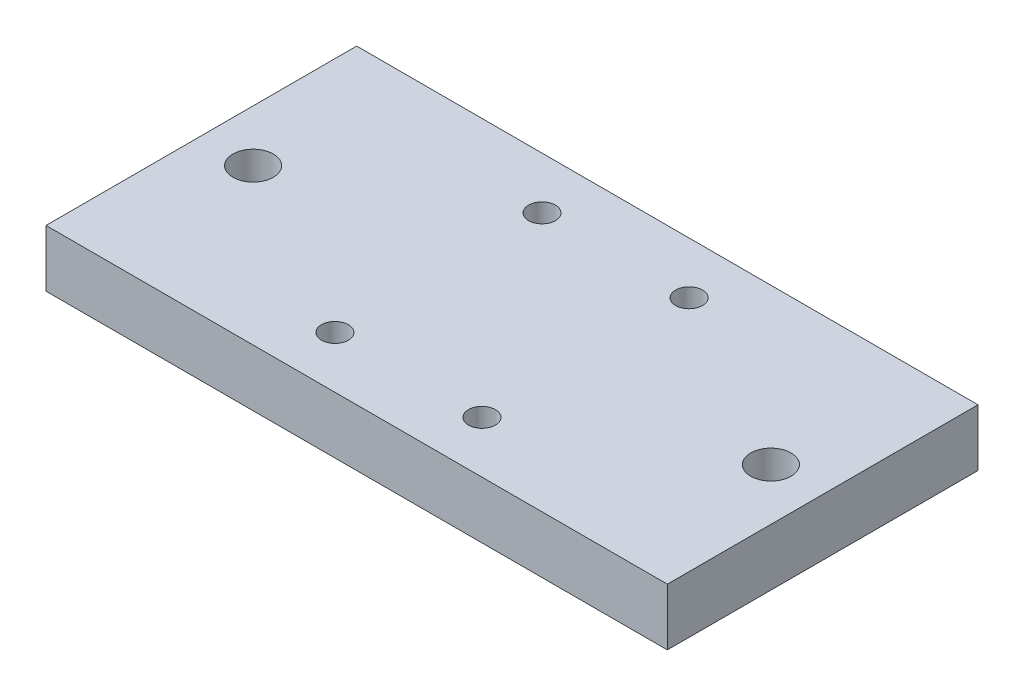
ISO-10303-21;
HEADER;
FILE_DESCRIPTION(('STEP AP214'),'2;1');
FILE_NAME('part.step','',(''),(''),'','','');
FILE_SCHEMA(('AUTOMOTIVE_DESIGN { 1 0 10303 214 1 1 1 1 }'));
ENDSEC;
DATA;
#1=APPLICATION_CONTEXT('core data for automotive mechanical design processes');
#2=APPLICATION_PROTOCOL_DEFINITION('international standard','automotive_design',2000,#1);
#3=PRODUCT_CONTEXT('',#1,'mechanical');
#4=PRODUCT('Part','Part','',(#3));
#5=PRODUCT_RELATED_PRODUCT_CATEGORY('part','',(#4));
#6=PRODUCT_DEFINITION_FORMATION('','',#4);
#7=PRODUCT_DEFINITION_CONTEXT('part definition',#1,'design');
#8=PRODUCT_DEFINITION('design','',#6,#7);
#9=PRODUCT_DEFINITION_SHAPE('','',#8);
#10=(LENGTH_UNIT() NAMED_UNIT(*) SI_UNIT(.MILLI.,.METRE.));
#11=(NAMED_UNIT(*) PLANE_ANGLE_UNIT() SI_UNIT($,.RADIAN.));
#12=(NAMED_UNIT(*) SI_UNIT($,.STERADIAN.) SOLID_ANGLE_UNIT());
#13=UNCERTAINTY_MEASURE_WITH_UNIT(LENGTH_MEASURE(1.E-05),#10,'distance_accuracy_value','');
#14=(GEOMETRIC_REPRESENTATION_CONTEXT(3) GLOBAL_UNCERTAINTY_ASSIGNED_CONTEXT((#13)) GLOBAL_UNIT_ASSIGNED_CONTEXT((#10,
#11,#12)) REPRESENTATION_CONTEXT('',''));
#15=CARTESIAN_POINT('',(0.,0.,0.));
#16=DIRECTION('',(0.,0.,1.));
#17=DIRECTION('',(1.,0.,0.));
#18=AXIS2_PLACEMENT_3D('',#15,#16,#17);
#19=CARTESIAN_POINT('',(0.,55.,-300.));
#20=DIRECTION('',(1.,0.,0.));
#21=DIRECTION('',(0.,0.,-1.));
#22=AXIS2_PLACEMENT_3D('',#19,#20,#21);
#23=PLANE('',#22);
#24=DIRECTION('',(0.,0.,1.));
#25=VECTOR('',#24,1.);
#26=CARTESIAN_POINT('',(0.,0.,-300.));
#27=LINE('',#26,#25);
#28=CARTESIAN_POINT('',(0.,0.,-300.));
#29=VERTEX_POINT('',#28);
#30=CARTESIAN_POINT('',(0.,0.,0.));
#31=VERTEX_POINT('',#30);
#32=EDGE_CURVE('E97',#29,#31,#27,.T.);
#33=ORIENTED_EDGE('',*,*,#32,.T.);
#34=DIRECTION('',(0.,-1.,0.));
#35=VECTOR('',#34,1.);
#36=CARTESIAN_POINT('',(0.,55.,0.));
#37=LINE('',#36,#35);
#38=CARTESIAN_POINT('',(0.,55.,0.));
#39=VERTEX_POINT('',#38);
#40=EDGE_CURVE('E11',#39,#31,#37,.T.);
#41=ORIENTED_EDGE('',*,*,#40,.F.);
#42=DIRECTION('',(0.,0.,1.));
#43=VECTOR('',#42,1.);
#44=CARTESIAN_POINT('',(0.,55.,-300.));
#45=LINE('',#44,#43);
#46=CARTESIAN_POINT('',(0.,55.,-300.));
#47=VERTEX_POINT('',#46);
#48=EDGE_CURVE('E85',#47,#39,#45,.T.);
#49=ORIENTED_EDGE('',*,*,#48,.F.);
#50=DIRECTION('',(0.,-1.,0.));
#51=VECTOR('',#50,1.);
#52=CARTESIAN_POINT('',(0.,55.,-300.));
#53=LINE('',#52,#51);
#54=EDGE_CURVE('E93',#47,#29,#53,.T.);
#55=ORIENTED_EDGE('',*,*,#54,.T.);
#56=EDGE_LOOP('',(#33,#41,#49,#55));
#57=FACE_BOUND('',#56,.T.);
#58=ADVANCED_FACE('F34',(#57),#23,.F.);
#59=CARTESIAN_POINT('',(0.,55.,0.));
#60=DIRECTION('',(0.,0.,-1.));
#61=DIRECTION('',(-1.,0.,0.));
#62=AXIS2_PLACEMENT_3D('',#59,#60,#61);
#63=PLANE('',#62);
#64=DIRECTION('',(1.,0.,0.));
#65=VECTOR('',#64,1.);
#66=CARTESIAN_POINT('',(0.,0.,0.));
#67=LINE('',#66,#65);
#68=CARTESIAN_POINT('',(600.,0.,0.));
#69=VERTEX_POINT('',#68);
#70=EDGE_CURVE('E89',#31,#69,#67,.T.);
#71=ORIENTED_EDGE('',*,*,#70,.T.);
#72=DIRECTION('',(0.,-1.,0.));
#73=VECTOR('',#72,1.);
#74=CARTESIAN_POINT('',(600.,55.,0.));
#75=LINE('',#74,#73);
#76=CARTESIAN_POINT('',(600.,55.,0.));
#77=VERTEX_POINT('',#76);
#78=EDGE_CURVE('E42',#77,#69,#75,.T.);
#79=ORIENTED_EDGE('',*,*,#78,.F.);
#80=DIRECTION('',(1.,0.,0.));
#81=VECTOR('',#80,1.);
#82=CARTESIAN_POINT('',(0.,55.,0.));
#83=LINE('',#82,#81);
#84=EDGE_CURVE('E80',#39,#77,#83,.T.);
#85=ORIENTED_EDGE('',*,*,#84,.F.);
#86=ORIENTED_EDGE('',*,*,#40,.T.);
#87=EDGE_LOOP('',(#71,#79,#85,#86));
#88=FACE_BOUND('',#87,.T.);
#89=ADVANCED_FACE('F88',(#88),#63,.F.);
#90=CARTESIAN_POINT('',(600.,55.,-300.));
#91=DIRECTION('',(-1.,0.,0.));
#92=DIRECTION('',(0.,0.,1.));
#93=AXIS2_PLACEMENT_3D('',#90,#91,#92);
#94=PLANE('',#93);
#95=DIRECTION('',(0.,0.,-1.));
#96=VECTOR('',#95,1.);
#97=CARTESIAN_POINT('',(600.,0.,-300.));
#98=LINE('',#97,#96);
#99=CARTESIAN_POINT('',(600.,0.,-300.));
#100=VERTEX_POINT('',#99);
#101=EDGE_CURVE('E67',#69,#100,#98,.T.);
#102=ORIENTED_EDGE('',*,*,#101,.T.);
#103=DIRECTION('',(0.,-1.,0.));
#104=VECTOR('',#103,1.);
#105=CARTESIAN_POINT('',(600.,55.,-300.));
#106=LINE('',#105,#104);
#107=CARTESIAN_POINT('',(600.,55.,-300.));
#108=VERTEX_POINT('',#107);
#109=EDGE_CURVE('E90',#108,#100,#106,.T.);
#110=ORIENTED_EDGE('',*,*,#109,.F.);
#111=DIRECTION('',(0.,0.,-1.));
#112=VECTOR('',#111,1.);
#113=CARTESIAN_POINT('',(600.,55.,-300.));
#114=LINE('',#113,#112);
#115=EDGE_CURVE('E83',#77,#108,#114,.T.);
#116=ORIENTED_EDGE('',*,*,#115,.F.);
#117=ORIENTED_EDGE('',*,*,#78,.T.);
#118=EDGE_LOOP('',(#102,#110,#116,#117));
#119=FACE_BOUND('',#118,.T.);
#120=ADVANCED_FACE('F91',(#119),#94,.F.);
#121=CARTESIAN_POINT('',(0.,55.,-300.));
#122=DIRECTION('',(0.,0.,1.));
#123=DIRECTION('',(1.,0.,0.));
#124=AXIS2_PLACEMENT_3D('',#121,#122,#123);
#125=PLANE('',#124);
#126=DIRECTION('',(-1.,0.,0.));
#127=VECTOR('',#126,1.);
#128=CARTESIAN_POINT('',(0.,0.,-300.));
#129=LINE('',#128,#127);
#130=EDGE_CURVE('E73',#100,#29,#129,.T.);
#131=ORIENTED_EDGE('',*,*,#130,.T.);
#132=ORIENTED_EDGE('',*,*,#54,.F.);
#133=DIRECTION('',(-1.,0.,0.));
#134=VECTOR('',#133,1.);
#135=CARTESIAN_POINT('',(0.,55.,-300.));
#136=LINE('',#135,#134);
#137=EDGE_CURVE('E50',#108,#47,#136,.T.);
#138=ORIENTED_EDGE('',*,*,#137,.F.);
#139=ORIENTED_EDGE('',*,*,#109,.T.);
#140=EDGE_LOOP('',(#131,#132,#138,#139));
#141=FACE_BOUND('',#140,.T.);
#142=ADVANCED_FACE('F105',(#141),#125,.F.);
#143=CARTESIAN_POINT('',(0.,55.,0.));
#144=DIRECTION('',(0.,1.,0.));
#145=DIRECTION('',(0.,0.,1.));
#146=AXIS2_PLACEMENT_3D('',#143,#144,#145);
#147=PLANE('',#146);
#148=CARTESIAN_POINT('',(229.,55.,-50.));
#149=DIRECTION('',(0.,1.,0.));
#150=DIRECTION('',(0.,0.,1.));
#151=AXIS2_PLACEMENT_3D('',#148,#149,#150);
#152=CIRCLE('',#151,13.);
#153=CARTESIAN_POINT('',(229.,55.,-37.));
#154=VERTEX_POINT('',#153);
#155=EDGE_CURVE('E141',#154,#154,#152,.T.);
#156=ORIENTED_EDGE('',*,*,#155,.F.);
#157=EDGE_LOOP('',(#156));
#158=FACE_BOUND('',#157,.T.);
#159=CARTESIAN_POINT('',(371.,55.,-50.));
#160=DIRECTION('',(0.,1.,0.));
#161=DIRECTION('',(0.,0.,1.));
#162=AXIS2_PLACEMENT_3D('',#159,#160,#161);
#163=CIRCLE('',#162,13.);
#164=CARTESIAN_POINT('',(371.,55.,-37.));
#165=VERTEX_POINT('',#164);
#166=EDGE_CURVE('E135',#165,#165,#163,.T.);
#167=ORIENTED_EDGE('',*,*,#166,.F.);
#168=EDGE_LOOP('',(#167));
#169=FACE_BOUND('',#168,.T.);
#170=CARTESIAN_POINT('',(371.,55.,-250.));
#171=DIRECTION('',(0.,1.,0.));
#172=DIRECTION('',(0.,0.,1.));
#173=AXIS2_PLACEMENT_3D('',#170,#171,#172);
#174=CIRCLE('',#173,13.);
#175=CARTESIAN_POINT('',(371.,55.,-237.));
#176=VERTEX_POINT('',#175);
#177=EDGE_CURVE('E129',#176,#176,#174,.T.);
#178=ORIENTED_EDGE('',*,*,#177,.F.);
#179=EDGE_LOOP('',(#178));
#180=FACE_BOUND('',#179,.T.);
#181=CARTESIAN_POINT('',(229.,55.,-250.));
#182=DIRECTION('',(0.,1.,0.));
#183=DIRECTION('',(0.,0.,1.));
#184=AXIS2_PLACEMENT_3D('',#181,#182,#183);
#185=CIRCLE('',#184,13.);
#186=CARTESIAN_POINT('',(229.,55.,-237.));
#187=VERTEX_POINT('',#186);
#188=EDGE_CURVE('E123',#187,#187,#185,.T.);
#189=ORIENTED_EDGE('',*,*,#188,.F.);
#190=EDGE_LOOP('',(#189));
#191=FACE_BOUND('',#190,.T.);
#192=CARTESIAN_POINT('',(550.,55.,-150.));
#193=DIRECTION('',(0.,1.,0.));
#194=DIRECTION('',(0.,0.,1.));
#195=AXIS2_PLACEMENT_3D('',#192,#193,#194);
#196=CIRCLE('',#195,19.5);
#197=CARTESIAN_POINT('',(550.,55.,-130.5));
#198=VERTEX_POINT('',#197);
#199=EDGE_CURVE('E117',#198,#198,#196,.T.);
#200=ORIENTED_EDGE('',*,*,#199,.F.);
#201=EDGE_LOOP('',(#200));
#202=FACE_BOUND('',#201,.T.);
#203=CARTESIAN_POINT('',(50.,55.,-150.));
#204=DIRECTION('',(0.,1.,0.));
#205=DIRECTION('',(0.,0.,1.));
#206=AXIS2_PLACEMENT_3D('',#203,#204,#205);
#207=CIRCLE('',#206,19.5);
#208=CARTESIAN_POINT('',(50.,55.,-130.5));
#209=VERTEX_POINT('',#208);
#210=EDGE_CURVE('E111',#209,#209,#207,.T.);
#211=ORIENTED_EDGE('',*,*,#210,.F.);
#212=EDGE_LOOP('',(#211));
#213=FACE_BOUND('',#212,.T.);
#214=ORIENTED_EDGE('',*,*,#48,.T.);
#215=ORIENTED_EDGE('',*,*,#84,.T.);
#216=ORIENTED_EDGE('',*,*,#115,.T.);
#217=ORIENTED_EDGE('',*,*,#137,.T.);
#218=EDGE_LOOP('',(#214,#215,#216,#217));
#219=FACE_BOUND('',#218,.T.);
#220=ADVANCED_FACE('F81',(#158,#169,#180,#191,#202,#213,#219),#147,.T.);
#221=CARTESIAN_POINT('',(0.,0.,0.));
#222=DIRECTION('',(0.,1.,0.));
#223=DIRECTION('',(0.,0.,1.));
#224=AXIS2_PLACEMENT_3D('',#221,#222,#223);
#225=PLANE('',#224);
#226=CARTESIAN_POINT('',(229.,0.,-50.));
#227=DIRECTION('',(0.,1.,0.));
#228=DIRECTION('',(0.,0.,1.));
#229=AXIS2_PLACEMENT_3D('',#226,#227,#228);
#230=CIRCLE('',#229,13.);
#231=CARTESIAN_POINT('',(229.,0.,-37.));
#232=VERTEX_POINT('',#231);
#233=EDGE_CURVE('E138',#232,#232,#230,.T.);
#234=ORIENTED_EDGE('',*,*,#233,.T.);
#235=EDGE_LOOP('',(#234));
#236=FACE_BOUND('',#235,.T.);
#237=CARTESIAN_POINT('',(371.,0.,-50.));
#238=DIRECTION('',(0.,1.,0.));
#239=DIRECTION('',(0.,0.,1.));
#240=AXIS2_PLACEMENT_3D('',#237,#238,#239);
#241=CIRCLE('',#240,13.);
#242=CARTESIAN_POINT('',(371.,0.,-37.));
#243=VERTEX_POINT('',#242);
#244=EDGE_CURVE('E132',#243,#243,#241,.T.);
#245=ORIENTED_EDGE('',*,*,#244,.T.);
#246=EDGE_LOOP('',(#245));
#247=FACE_BOUND('',#246,.T.);
#248=CARTESIAN_POINT('',(371.,0.,-250.));
#249=DIRECTION('',(0.,1.,0.));
#250=DIRECTION('',(0.,0.,1.));
#251=AXIS2_PLACEMENT_3D('',#248,#249,#250);
#252=CIRCLE('',#251,13.);
#253=CARTESIAN_POINT('',(371.,0.,-237.));
#254=VERTEX_POINT('',#253);
#255=EDGE_CURVE('E126',#254,#254,#252,.T.);
#256=ORIENTED_EDGE('',*,*,#255,.T.);
#257=EDGE_LOOP('',(#256));
#258=FACE_BOUND('',#257,.T.);
#259=CARTESIAN_POINT('',(229.,0.,-250.));
#260=DIRECTION('',(0.,1.,0.));
#261=DIRECTION('',(0.,0.,1.));
#262=AXIS2_PLACEMENT_3D('',#259,#260,#261);
#263=CIRCLE('',#262,13.);
#264=CARTESIAN_POINT('',(229.,0.,-237.));
#265=VERTEX_POINT('',#264);
#266=EDGE_CURVE('E120',#265,#265,#263,.T.);
#267=ORIENTED_EDGE('',*,*,#266,.T.);
#268=EDGE_LOOP('',(#267));
#269=FACE_BOUND('',#268,.T.);
#270=CARTESIAN_POINT('',(550.,0.,-150.));
#271=DIRECTION('',(0.,1.,0.));
#272=DIRECTION('',(0.,0.,1.));
#273=AXIS2_PLACEMENT_3D('',#270,#271,#272);
#274=CIRCLE('',#273,19.5);
#275=CARTESIAN_POINT('',(550.,0.,-130.5));
#276=VERTEX_POINT('',#275);
#277=EDGE_CURVE('E114',#276,#276,#274,.T.);
#278=ORIENTED_EDGE('',*,*,#277,.T.);
#279=EDGE_LOOP('',(#278));
#280=FACE_BOUND('',#279,.T.);
#281=CARTESIAN_POINT('',(50.,0.,-150.));
#282=DIRECTION('',(0.,1.,0.));
#283=DIRECTION('',(0.,0.,1.));
#284=AXIS2_PLACEMENT_3D('',#281,#282,#283);
#285=CIRCLE('',#284,19.5);
#286=CARTESIAN_POINT('',(50.,0.,-130.5));
#287=VERTEX_POINT('',#286);
#288=EDGE_CURVE('E100',#287,#287,#285,.T.);
#289=ORIENTED_EDGE('',*,*,#288,.T.);
#290=EDGE_LOOP('',(#289));
#291=FACE_BOUND('',#290,.T.);
#292=ORIENTED_EDGE('',*,*,#32,.F.);
#293=ORIENTED_EDGE('',*,*,#130,.F.);
#294=ORIENTED_EDGE('',*,*,#101,.F.);
#295=ORIENTED_EDGE('',*,*,#70,.F.);
#296=EDGE_LOOP('',(#292,#293,#294,#295));
#297=FACE_BOUND('',#296,.T.);
#298=ADVANCED_FACE('F108',(#236,#247,#258,#269,#280,#291,#297),#225,.F.);
#299=CARTESIAN_POINT('',(50.,0.,-150.));
#300=DIRECTION('',(0.,1.,0.));
#301=DIRECTION('',(0.,0.,1.));
#302=AXIS2_PLACEMENT_3D('',#299,#300,#301);
#303=CYLINDRICAL_SURFACE('',#302,19.5);
#304=ORIENTED_EDGE('',*,*,#288,.F.);
#305=EDGE_LOOP('',(#304));
#306=FACE_BOUND('',#305,.T.);
#307=ORIENTED_EDGE('',*,*,#210,.T.);
#308=EDGE_LOOP('',(#307));
#309=FACE_BOUND('',#308,.T.);
#310=ADVANCED_FACE('F169',(#306,#309),#303,.F.);
#311=CARTESIAN_POINT('',(550.,0.,-150.));
#312=DIRECTION('',(0.,1.,0.));
#313=DIRECTION('',(0.,0.,1.));
#314=AXIS2_PLACEMENT_3D('',#311,#312,#313);
#315=CYLINDRICAL_SURFACE('',#314,19.5);
#316=ORIENTED_EDGE('',*,*,#277,.F.);
#317=EDGE_LOOP('',(#316));
#318=FACE_BOUND('',#317,.T.);
#319=ORIENTED_EDGE('',*,*,#199,.T.);
#320=EDGE_LOOP('',(#319));
#321=FACE_BOUND('',#320,.T.);
#322=ADVANCED_FACE('F171',(#318,#321),#315,.F.);
#323=CARTESIAN_POINT('',(229.,0.,-250.));
#324=DIRECTION('',(0.,1.,0.));
#325=DIRECTION('',(0.,0.,1.));
#326=AXIS2_PLACEMENT_3D('',#323,#324,#325);
#327=CYLINDRICAL_SURFACE('',#326,13.);
#328=ORIENTED_EDGE('',*,*,#266,.F.);
#329=EDGE_LOOP('',(#328));
#330=FACE_BOUND('',#329,.T.);
#331=ORIENTED_EDGE('',*,*,#188,.T.);
#332=EDGE_LOOP('',(#331));
#333=FACE_BOUND('',#332,.T.);
#334=ADVANCED_FACE('F178',(#330,#333),#327,.F.);
#335=CARTESIAN_POINT('',(371.,0.,-250.));
#336=DIRECTION('',(0.,1.,0.));
#337=DIRECTION('',(0.,0.,1.));
#338=AXIS2_PLACEMENT_3D('',#335,#336,#337);
#339=CYLINDRICAL_SURFACE('',#338,13.);
#340=ORIENTED_EDGE('',*,*,#255,.F.);
#341=EDGE_LOOP('',(#340));
#342=FACE_BOUND('',#341,.T.);
#343=ORIENTED_EDGE('',*,*,#177,.T.);
#344=EDGE_LOOP('',(#343));
#345=FACE_BOUND('',#344,.T.);
#346=ADVANCED_FACE('F224',(#342,#345),#339,.F.);
#347=CARTESIAN_POINT('',(371.,0.,-50.));
#348=DIRECTION('',(0.,1.,0.));
#349=DIRECTION('',(0.,0.,1.));
#350=AXIS2_PLACEMENT_3D('',#347,#348,#349);
#351=CYLINDRICAL_SURFACE('',#350,13.);
#352=ORIENTED_EDGE('',*,*,#244,.F.);
#353=EDGE_LOOP('',(#352));
#354=FACE_BOUND('',#353,.T.);
#355=ORIENTED_EDGE('',*,*,#166,.T.);
#356=EDGE_LOOP('',(#355));
#357=FACE_BOUND('',#356,.T.);
#358=ADVANCED_FACE('F152',(#354,#357),#351,.F.);
#359=CARTESIAN_POINT('',(229.,0.,-50.));
#360=DIRECTION('',(0.,1.,0.));
#361=DIRECTION('',(0.,0.,1.));
#362=AXIS2_PLACEMENT_3D('',#359,#360,#361);
#363=CYLINDRICAL_SURFACE('',#362,13.);
#364=ORIENTED_EDGE('',*,*,#233,.F.);
#365=EDGE_LOOP('',(#364));
#366=FACE_BOUND('',#365,.T.);
#367=ORIENTED_EDGE('',*,*,#155,.T.);
#368=EDGE_LOOP('',(#367));
#369=FACE_BOUND('',#368,.T.);
#370=ADVANCED_FACE('F149',(#366,#369),#363,.F.);
#371=CLOSED_SHELL('',(#58,#89,#120,#142,#220,#298,#310,#322,#334,#346,#358,#370));
#372=MANIFOLD_SOLID_BREP('B2',#371);
#373=ADVANCED_BREP_SHAPE_REPRESENTATION('',(#18,#372),#14);
#374=SHAPE_DEFINITION_REPRESENTATION(#9,#373);
ENDSEC;
END-ISO-10303-21;
